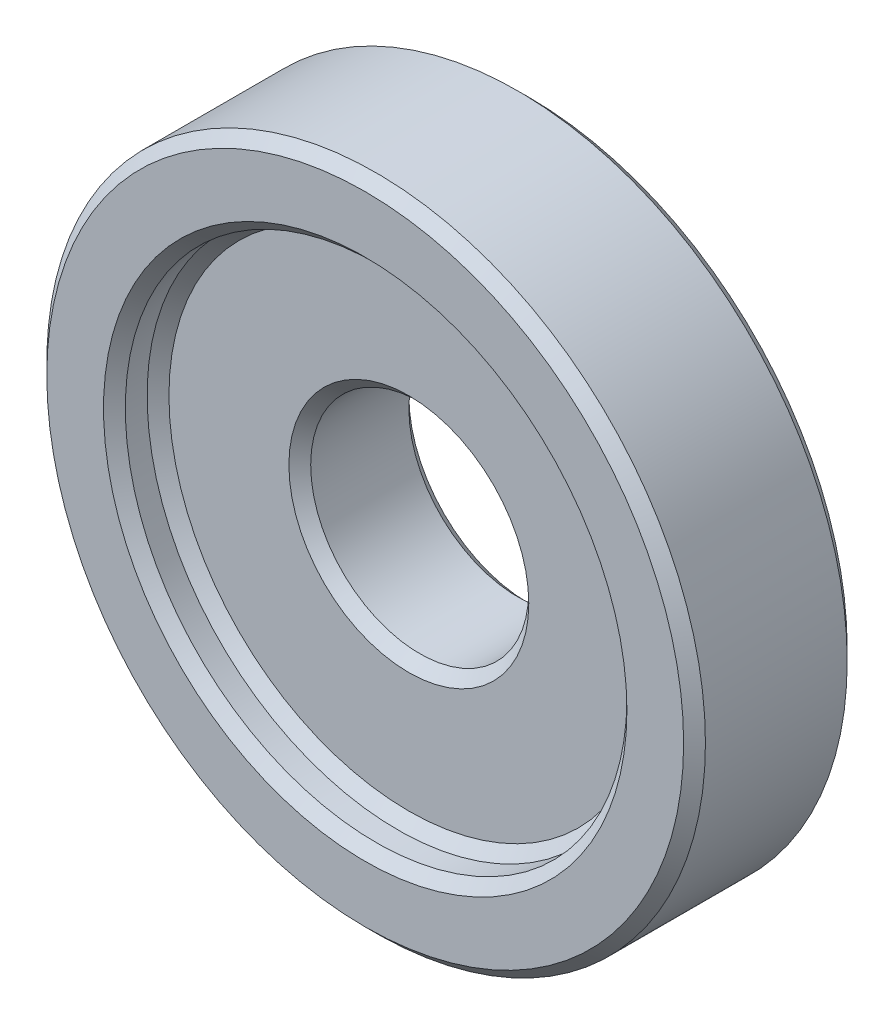
ISO-10303-21;
HEADER;
FILE_DESCRIPTION(('STEP AP214'),'2;1');
FILE_NAME('part.step','',(''),(''),'','','');
FILE_SCHEMA(('AUTOMOTIVE_DESIGN { 1 0 10303 214 1 1 1 1 }'));
ENDSEC;
DATA;
#1=APPLICATION_CONTEXT('core data for automotive mechanical design processes');
#2=APPLICATION_PROTOCOL_DEFINITION('international standard','automotive_design',2000,#1);
#3=PRODUCT_CONTEXT('',#1,'mechanical');
#4=PRODUCT('Part','Part','',(#3));
#5=PRODUCT_RELATED_PRODUCT_CATEGORY('part','',(#4));
#6=PRODUCT_DEFINITION_FORMATION('','',#4);
#7=PRODUCT_DEFINITION_CONTEXT('part definition',#1,'design');
#8=PRODUCT_DEFINITION('design','',#6,#7);
#9=PRODUCT_DEFINITION_SHAPE('','',#8);
#10=(LENGTH_UNIT() NAMED_UNIT(*) SI_UNIT(.MILLI.,.METRE.));
#11=(NAMED_UNIT(*) PLANE_ANGLE_UNIT() SI_UNIT($,.RADIAN.));
#12=(NAMED_UNIT(*) SI_UNIT($,.STERADIAN.) SOLID_ANGLE_UNIT());
#13=UNCERTAINTY_MEASURE_WITH_UNIT(LENGTH_MEASURE(1.E-05),#10,'distance_accuracy_value','');
#14=(GEOMETRIC_REPRESENTATION_CONTEXT(3) GLOBAL_UNCERTAINTY_ASSIGNED_CONTEXT((#13)) GLOBAL_UNIT_ASSIGNED_CONTEXT((#10,
#11,#12)) REPRESENTATION_CONTEXT('',''));
#15=CARTESIAN_POINT('',(0.,0.,0.));
#16=DIRECTION('',(0.,0.,1.));
#17=DIRECTION('',(1.,0.,0.));
#18=AXIS2_PLACEMENT_3D('',#15,#16,#17);
#19=CARTESIAN_POINT('',(0.,0.,7.5));
#20=DIRECTION('',(0.,0.,-1.));
#21=DIRECTION('',(-1.,0.,0.));
#22=AXIS2_PLACEMENT_3D('',#19,#20,#21);
#23=CYLINDRICAL_SURFACE('',#22,5.);
#24=CARTESIAN_POINT('',(0.,0.,0.500000000000005));
#25=DIRECTION('',(0.,0.,1.));
#26=DIRECTION('',(1.,0.,0.));
#27=AXIS2_PLACEMENT_3D('',#24,#25,#26);
#28=CIRCLE('',#27,5.);
#29=CARTESIAN_POINT('',(5.,0.,0.500000000000005));
#30=VERTEX_POINT('',#29);
#31=EDGE_CURVE('E43',#30,#30,#28,.F.);
#32=ORIENTED_EDGE('',*,*,#31,.T.);
#33=EDGE_LOOP('',(#32));
#34=FACE_BOUND('',#33,.T.);
#35=CARTESIAN_POINT('',(0.,0.,5.));
#36=DIRECTION('',(0.,0.,1.));
#37=DIRECTION('',(1.,0.,0.));
#38=AXIS2_PLACEMENT_3D('',#35,#36,#37);
#39=CIRCLE('',#38,5.);
#40=CARTESIAN_POINT('',(5.,0.,5.));
#41=VERTEX_POINT('',#40);
#42=EDGE_CURVE('E47',#41,#41,#39,.T.);
#43=ORIENTED_EDGE('',*,*,#42,.T.);
#44=EDGE_LOOP('',(#43));
#45=FACE_BOUND('',#44,.T.);
#46=ADVANCED_FACE('F32',(#34,#45),#23,.F.);
#47=CARTESIAN_POINT('',(0.,0.,7.5));
#48=DIRECTION('',(0.,0.,1.));
#49=DIRECTION('',(1.,0.,0.));
#50=AXIS2_PLACEMENT_3D('',#47,#48,#49);
#51=PLANE('',#50);
#52=CARTESIAN_POINT('',(0.,0.,7.5));
#53=DIRECTION('',(0.,0.,1.));
#54=DIRECTION('',(1.,0.,0.));
#55=AXIS2_PLACEMENT_3D('',#52,#53,#54);
#56=CIRCLE('',#55,12.);
#57=CARTESIAN_POINT('',(12.,0.,7.5));
#58=VERTEX_POINT('',#57);
#59=EDGE_CURVE('E58',#58,#58,#56,.F.);
#60=ORIENTED_EDGE('',*,*,#59,.T.);
#61=EDGE_LOOP('',(#60));
#62=FACE_BOUND('',#61,.T.);
#63=CARTESIAN_POINT('',(0.,0.,7.5));
#64=DIRECTION('',(0.,0.,1.));
#65=DIRECTION('',(1.,0.,0.));
#66=AXIS2_PLACEMENT_3D('',#63,#64,#65);
#67=CIRCLE('',#66,14.6);
#68=CARTESIAN_POINT('',(14.6,0.,7.5));
#69=VERTEX_POINT('',#68);
#70=EDGE_CURVE('E61',#69,#69,#67,.T.);
#71=ORIENTED_EDGE('',*,*,#70,.T.);
#72=EDGE_LOOP('',(#71));
#73=FACE_BOUND('',#72,.T.);
#74=ADVANCED_FACE('F88',(#62,#73),#51,.T.);
#75=CARTESIAN_POINT('',(0.,0.,0.));
#76=DIRECTION('',(0.,0.,1.));
#77=DIRECTION('',(1.,0.,0.));
#78=AXIS2_PLACEMENT_3D('',#75,#76,#77);
#79=PLANE('',#78);
#80=CARTESIAN_POINT('',(0.,0.,0.));
#81=DIRECTION('',(0.,0.,1.));
#82=DIRECTION('',(1.,0.,0.));
#83=AXIS2_PLACEMENT_3D('',#80,#81,#82);
#84=CIRCLE('',#83,5.5);
#85=CARTESIAN_POINT('',(5.5,0.,0.));
#86=VERTEX_POINT('',#85);
#87=EDGE_CURVE('E52',#86,#86,#84,.T.);
#88=ORIENTED_EDGE('',*,*,#87,.T.);
#89=EDGE_LOOP('',(#88));
#90=FACE_BOUND('',#89,.T.);
#91=CARTESIAN_POINT('',(0.,0.,0.));
#92=DIRECTION('',(0.,0.,1.));
#93=DIRECTION('',(1.,0.,0.));
#94=AXIS2_PLACEMENT_3D('',#91,#92,#93);
#95=CIRCLE('',#94,14.6);
#96=CARTESIAN_POINT('',(14.6,0.,0.));
#97=VERTEX_POINT('',#96);
#98=EDGE_CURVE('E55',#97,#97,#95,.F.);
#99=ORIENTED_EDGE('',*,*,#98,.T.);
#100=EDGE_LOOP('',(#99));
#101=FACE_BOUND('',#100,.T.);
#102=ADVANCED_FACE('F94',(#90,#101),#79,.F.);
#103=CARTESIAN_POINT('',(0.,0.,7.5));
#104=DIRECTION('',(0.,0.,-1.));
#105=DIRECTION('',(-1.,0.,0.));
#106=AXIS2_PLACEMENT_3D('',#103,#104,#105);
#107=CYLINDRICAL_SURFACE('',#106,15.1);
#108=CARTESIAN_POINT('',(0.,0.,0.500000000000004));
#109=DIRECTION('',(0.,0.,1.));
#110=DIRECTION('',(1.,0.,0.));
#111=AXIS2_PLACEMENT_3D('',#108,#109,#110);
#112=CIRCLE('',#111,15.1);
#113=CARTESIAN_POINT('',(15.1,0.,0.500000000000004));
#114=VERTEX_POINT('',#113);
#115=EDGE_CURVE('E10',#114,#114,#112,.T.);
#116=ORIENTED_EDGE('',*,*,#115,.T.);
#117=EDGE_LOOP('',(#116));
#118=FACE_BOUND('',#117,.T.);
#119=CARTESIAN_POINT('',(0.,0.,7.));
#120=DIRECTION('',(0.,0.,1.));
#121=DIRECTION('',(1.,0.,0.));
#122=AXIS2_PLACEMENT_3D('',#119,#120,#121);
#123=CIRCLE('',#122,15.1);
#124=CARTESIAN_POINT('',(15.1,0.,7.));
#125=VERTEX_POINT('',#124);
#126=EDGE_CURVE('E39',#125,#125,#123,.F.);
#127=ORIENTED_EDGE('',*,*,#126,.T.);
#128=EDGE_LOOP('',(#127));
#129=FACE_BOUND('',#128,.T.);
#130=ADVANCED_FACE('F103',(#118,#129),#107,.T.);
#131=CARTESIAN_POINT('',(0.,0.,5.5));
#132=DIRECTION('',(0.,0.,1.));
#133=DIRECTION('',(1.,0.,0.));
#134=AXIS2_PLACEMENT_3D('',#131,#132,#133);
#135=CYLINDRICAL_SURFACE('',#134,11.5);
#136=CARTESIAN_POINT('',(0.,0.,6.));
#137=DIRECTION('',(0.,0.,1.));
#138=DIRECTION('',(1.,0.,0.));
#139=AXIS2_PLACEMENT_3D('',#136,#137,#138);
#140=CIRCLE('',#139,11.5);
#141=CARTESIAN_POINT('',(11.5,0.,6.));
#142=VERTEX_POINT('',#141);
#143=EDGE_CURVE('E64',#142,#142,#140,.F.);
#144=ORIENTED_EDGE('',*,*,#143,.T.);
#145=EDGE_LOOP('',(#144));
#146=FACE_BOUND('',#145,.T.);
#147=CARTESIAN_POINT('',(0.,0.,7.));
#148=DIRECTION('',(0.,0.,1.));
#149=DIRECTION('',(1.,0.,0.));
#150=AXIS2_PLACEMENT_3D('',#147,#148,#149);
#151=CIRCLE('',#150,11.5);
#152=CARTESIAN_POINT('',(11.5,0.,7.));
#153=VERTEX_POINT('',#152);
#154=EDGE_CURVE('E67',#153,#153,#151,.T.);
#155=ORIENTED_EDGE('',*,*,#154,.T.);
#156=EDGE_LOOP('',(#155));
#157=FACE_BOUND('',#156,.T.);
#158=ADVANCED_FACE('F98',(#146,#157),#135,.F.);
#159=CARTESIAN_POINT('',(0.,0.,5.5));
#160=DIRECTION('',(0.,0.,1.));
#161=DIRECTION('',(1.,0.,0.));
#162=AXIS2_PLACEMENT_3D('',#159,#160,#161);
#163=PLANE('',#162);
#164=CARTESIAN_POINT('',(0.,0.,5.5));
#165=DIRECTION('',(0.,0.,1.));
#166=DIRECTION('',(1.,0.,0.));
#167=AXIS2_PLACEMENT_3D('',#164,#165,#166);
#168=CIRCLE('',#167,11.);
#169=CARTESIAN_POINT('',(11.,0.,5.5));
#170=VERTEX_POINT('',#169);
#171=EDGE_CURVE('E70',#170,#170,#168,.T.);
#172=ORIENTED_EDGE('',*,*,#171,.T.);
#173=EDGE_LOOP('',(#172));
#174=FACE_BOUND('',#173,.T.);
#175=CARTESIAN_POINT('',(0.,0.,5.5));
#176=DIRECTION('',(0.,0.,1.));
#177=DIRECTION('',(1.,0.,0.));
#178=AXIS2_PLACEMENT_3D('',#175,#176,#177);
#179=CIRCLE('',#178,5.5);
#180=CARTESIAN_POINT('',(5.5,0.,5.5));
#181=VERTEX_POINT('',#180);
#182=EDGE_CURVE('E73',#181,#181,#179,.F.);
#183=ORIENTED_EDGE('',*,*,#182,.T.);
#184=EDGE_LOOP('',(#183));
#185=FACE_BOUND('',#184,.T.);
#186=ADVANCED_FACE('F77',(#174,#185),#163,.T.);
#187=CARTESIAN_POINT('',(0.,0.,5.5));
#188=DIRECTION('',(0.,0.,1.));
#189=DIRECTION('',(1.,0.,0.));
#190=AXIS2_PLACEMENT_3D('',#187,#188,#189);
#191=CONICAL_SURFACE('',#190,11.,0.785398163397453);
#192=ORIENTED_EDGE('',*,*,#143,.F.);
#193=EDGE_LOOP('',(#192));
#194=FACE_BOUND('',#193,.T.);
#195=ORIENTED_EDGE('',*,*,#171,.F.);
#196=EDGE_LOOP('',(#195));
#197=FACE_BOUND('',#196,.T.);
#198=ADVANCED_FACE('F107',(#194,#197),#191,.F.);
#199=CARTESIAN_POINT('',(0.,0.,7.));
#200=DIRECTION('',(0.,0.,1.));
#201=DIRECTION('',(1.,0.,0.));
#202=AXIS2_PLACEMENT_3D('',#199,#200,#201);
#203=CONICAL_SURFACE('',#202,11.5,0.785398163397447);
#204=ORIENTED_EDGE('',*,*,#59,.F.);
#205=EDGE_LOOP('',(#204));
#206=FACE_BOUND('',#205,.T.);
#207=ORIENTED_EDGE('',*,*,#154,.F.);
#208=EDGE_LOOP('',(#207));
#209=FACE_BOUND('',#208,.T.);
#210=ADVANCED_FACE('F110',(#206,#209),#203,.F.);
#211=CARTESIAN_POINT('',(0.,0.,0.));
#212=DIRECTION('',(0.,0.,-1.));
#213=DIRECTION('',(-1.,0.,0.));
#214=AXIS2_PLACEMENT_3D('',#211,#212,#213);
#215=CONICAL_SURFACE('',#214,5.5,0.785398163397445);
#216=ORIENTED_EDGE('',*,*,#31,.F.);
#217=EDGE_LOOP('',(#216));
#218=FACE_BOUND('',#217,.T.);
#219=ORIENTED_EDGE('',*,*,#87,.F.);
#220=EDGE_LOOP('',(#219));
#221=FACE_BOUND('',#220,.T.);
#222=ADVANCED_FACE('F83',(#218,#221),#215,.F.);
#223=CARTESIAN_POINT('',(0.,0.,5.));
#224=DIRECTION('',(0.,0.,1.));
#225=DIRECTION('',(1.,0.,0.));
#226=AXIS2_PLACEMENT_3D('',#223,#224,#225);
#227=CONICAL_SURFACE('',#226,5.,0.785398163397448);
#228=ORIENTED_EDGE('',*,*,#182,.F.);
#229=EDGE_LOOP('',(#228));
#230=FACE_BOUND('',#229,.T.);
#231=ORIENTED_EDGE('',*,*,#42,.F.);
#232=EDGE_LOOP('',(#231));
#233=FACE_BOUND('',#232,.T.);
#234=ADVANCED_FACE('F79',(#230,#233),#227,.F.);
#235=CARTESIAN_POINT('',(0.,0.,0.500000000000004));
#236=DIRECTION('',(0.,0.,1.));
#237=DIRECTION('',(1.,0.,0.));
#238=AXIS2_PLACEMENT_3D('',#235,#236,#237);
#239=CONICAL_SURFACE('',#238,15.1,0.785398163397448);
#240=ORIENTED_EDGE('',*,*,#98,.F.);
#241=EDGE_LOOP('',(#240));
#242=FACE_BOUND('',#241,.T.);
#243=ORIENTED_EDGE('',*,*,#115,.F.);
#244=EDGE_LOOP('',(#243));
#245=FACE_BOUND('',#244,.T.);
#246=ADVANCED_FACE('F82',(#242,#245),#239,.T.);
#247=CARTESIAN_POINT('',(0.,0.,7.5));
#248=DIRECTION('',(0.,0.,-1.));
#249=DIRECTION('',(-1.,0.,0.));
#250=AXIS2_PLACEMENT_3D('',#247,#248,#249);
#251=CONICAL_SURFACE('',#250,14.6,0.785398163397448);
#252=ORIENTED_EDGE('',*,*,#126,.F.);
#253=EDGE_LOOP('',(#252));
#254=FACE_BOUND('',#253,.T.);
#255=ORIENTED_EDGE('',*,*,#70,.F.);
#256=EDGE_LOOP('',(#255));
#257=FACE_BOUND('',#256,.T.);
#258=ADVANCED_FACE('F34',(#254,#257),#251,.T.);
#259=CLOSED_SHELL('',(#46,#74,#102,#130,#158,#186,#198,#210,#222,#234,#246,#258));
#260=MANIFOLD_SOLID_BREP('B2',#259);
#261=ADVANCED_BREP_SHAPE_REPRESENTATION('',(#18,#260),#14);
#262=SHAPE_DEFINITION_REPRESENTATION(#9,#261);
ENDSEC;
END-ISO-10303-21;
